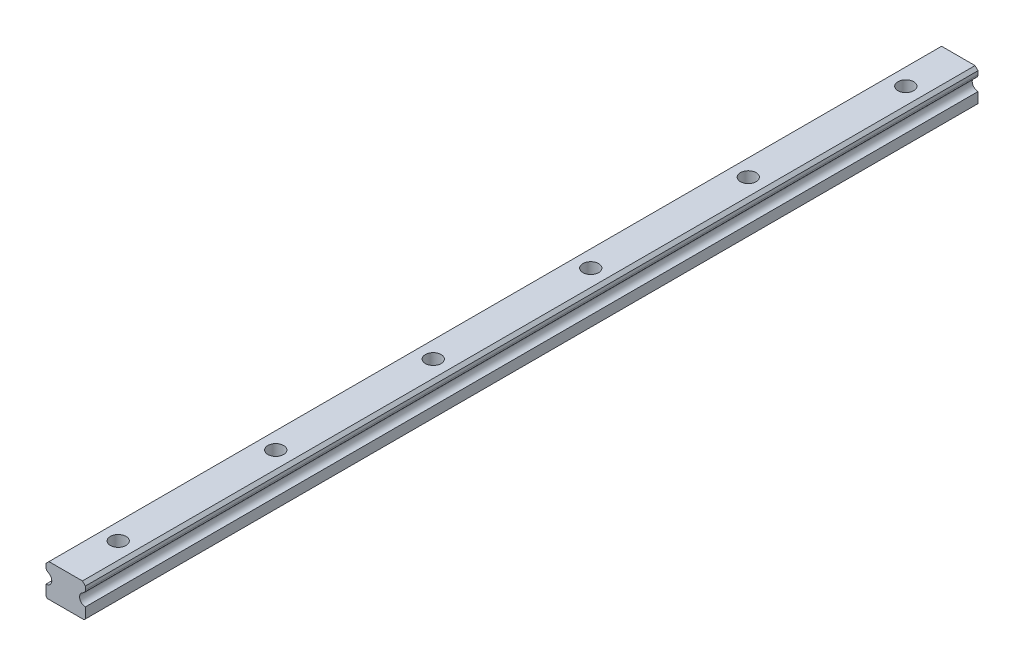
ISO-10303-21;
HEADER;
FILE_DESCRIPTION(('STEP AP214'),'2;1');
FILE_NAME('part.step','',(''),(''),'','','');
FILE_SCHEMA(('AUTOMOTIVE_DESIGN { 1 0 10303 214 1 1 1 1 }'));
ENDSEC;
DATA;
#1=APPLICATION_CONTEXT('core data for automotive mechanical design processes');
#2=APPLICATION_PROTOCOL_DEFINITION('international standard','automotive_design',2000,#1);
#3=PRODUCT_CONTEXT('',#1,'mechanical');
#4=PRODUCT('Part','Part','',(#3));
#5=PRODUCT_RELATED_PRODUCT_CATEGORY('part','',(#4));
#6=PRODUCT_DEFINITION_FORMATION('','',#4);
#7=PRODUCT_DEFINITION_CONTEXT('part definition',#1,'design');
#8=PRODUCT_DEFINITION('design','',#6,#7);
#9=PRODUCT_DEFINITION_SHAPE('','',#8);
#10=(LENGTH_UNIT() NAMED_UNIT(*) SI_UNIT(.MILLI.,.METRE.));
#11=(NAMED_UNIT(*) PLANE_ANGLE_UNIT() SI_UNIT($,.RADIAN.));
#12=(NAMED_UNIT(*) SI_UNIT($,.STERADIAN.) SOLID_ANGLE_UNIT());
#13=UNCERTAINTY_MEASURE_WITH_UNIT(LENGTH_MEASURE(1.E-05),#10,'distance_accuracy_value','');
#14=(GEOMETRIC_REPRESENTATION_CONTEXT(3) GLOBAL_UNCERTAINTY_ASSIGNED_CONTEXT((#13)) GLOBAL_UNIT_ASSIGNED_CONTEXT((#10,
#11,#12)) REPRESENTATION_CONTEXT('',''));
#15=CARTESIAN_POINT('',(0.,0.,0.));
#16=DIRECTION('',(0.,0.,1.));
#17=DIRECTION('',(1.,0.,0.));
#18=AXIS2_PLACEMENT_3D('',#15,#16,#17);
#19=CARTESIAN_POINT('',(-7.5,4.505,170.));
#20=DIRECTION('',(1.,0.,0.));
#21=DIRECTION('',(0.,0.,-1.));
#22=AXIS2_PLACEMENT_3D('',#19,#20,#21);
#23=PLANE('',#22);
#24=DIRECTION('',(0.,0.,-1.));
#25=VECTOR('',#24,1.);
#26=CARTESIAN_POINT('',(-7.5,4.505,170.));
#27=LINE('',#26,#25);
#28=CARTESIAN_POINT('',(-7.5,4.505,170.));
#29=VERTEX_POINT('',#28);
#30=CARTESIAN_POINT('',(-7.5,4.505,-170.));
#31=VERTEX_POINT('',#30);
#32=EDGE_CURVE('E135',#29,#31,#27,.T.);
#33=ORIENTED_EDGE('',*,*,#32,.T.);
#34=DIRECTION('',(0.,-1.,0.));
#35=VECTOR('',#34,1.);
#36=CARTESIAN_POINT('',(-7.5,4.505,-170.));
#37=LINE('',#36,#35);
#38=CARTESIAN_POINT('',(-7.5,0.5,-170.));
#39=VERTEX_POINT('',#38);
#40=EDGE_CURVE('E129',#31,#39,#37,.T.);
#41=ORIENTED_EDGE('',*,*,#40,.T.);
#42=DIRECTION('',(0.,0.,-1.));
#43=VECTOR('',#42,1.);
#44=CARTESIAN_POINT('',(-7.5,0.5,170.));
#45=LINE('',#44,#43);
#46=CARTESIAN_POINT('',(-7.5,0.5,170.));
#47=VERTEX_POINT('',#46);
#48=EDGE_CURVE('E11',#47,#39,#45,.T.);
#49=ORIENTED_EDGE('',*,*,#48,.F.);
#50=DIRECTION('',(0.,-1.,0.));
#51=VECTOR('',#50,1.);
#52=CARTESIAN_POINT('',(-7.5,4.505,170.));
#53=LINE('',#52,#51);
#54=EDGE_CURVE('E176',#29,#47,#53,.T.);
#55=ORIENTED_EDGE('',*,*,#54,.F.);
#56=EDGE_LOOP('',(#33,#41,#49,#55));
#57=FACE_BOUND('',#56,.T.);
#58=ADVANCED_FACE('F17',(#57),#23,.F.);
#59=CARTESIAN_POINT('',(-7.5,0.5,170.));
#60=DIRECTION('',(0.707106781186548,0.707106781186547,0.));
#61=DIRECTION('',(-0.707106781186547,0.707106781186548,0.));
#62=AXIS2_PLACEMENT_3D('',#59,#60,#61);
#63=PLANE('',#62);
#64=ORIENTED_EDGE('',*,*,#48,.T.);
#65=DIRECTION('',(0.707106781186547,-0.707106781186548,0.));
#66=VECTOR('',#65,1.);
#67=CARTESIAN_POINT('',(-7.5,0.5,-170.));
#68=LINE('',#67,#66);
#69=CARTESIAN_POINT('',(-7.,0.,-170.));
#70=VERTEX_POINT('',#69);
#71=EDGE_CURVE('E119',#39,#70,#68,.T.);
#72=ORIENTED_EDGE('',*,*,#71,.T.);
#73=DIRECTION('',(0.,0.,-1.));
#74=VECTOR('',#73,1.);
#75=CARTESIAN_POINT('',(-7.,0.,170.));
#76=LINE('',#75,#74);
#77=CARTESIAN_POINT('',(-7.,0.,170.));
#78=VERTEX_POINT('',#77);
#79=EDGE_CURVE('E24',#78,#70,#76,.T.);
#80=ORIENTED_EDGE('',*,*,#79,.F.);
#81=DIRECTION('',(0.707106781186547,-0.707106781186548,0.));
#82=VECTOR('',#81,1.);
#83=CARTESIAN_POINT('',(-7.5,0.5,170.));
#84=LINE('',#83,#82);
#85=EDGE_CURVE('E120',#47,#78,#84,.T.);
#86=ORIENTED_EDGE('',*,*,#85,.F.);
#87=EDGE_LOOP('',(#64,#72,#80,#86));
#88=FACE_BOUND('',#87,.T.);
#89=ADVANCED_FACE('F117',(#88),#63,.F.);
#90=CARTESIAN_POINT('',(-7.,0.,170.));
#91=DIRECTION('',(0.,1.,0.));
#92=DIRECTION('',(0.,0.,1.));
#93=AXIS2_PLACEMENT_3D('',#90,#91,#92);
#94=PLANE('',#93);
#95=CARTESIAN_POINT('',(0.,0.,150.));
#96=DIRECTION('',(0.,1.,0.));
#97=DIRECTION('',(0.,0.,1.));
#98=AXIS2_PLACEMENT_3D('',#95,#96,#97);
#99=CIRCLE('',#98,1.75);
#100=CARTESIAN_POINT('',(0.,0.,151.75));
#101=VERTEX_POINT('',#100);
#102=EDGE_CURVE('E542',#101,#101,#99,.T.);
#103=ORIENTED_EDGE('',*,*,#102,.T.);
#104=EDGE_LOOP('',(#103));
#105=FACE_BOUND('',#104,.T.);
#106=CARTESIAN_POINT('',(0.,0.,90.));
#107=DIRECTION('',(0.,1.,0.));
#108=DIRECTION('',(0.,0.,1.));
#109=AXIS2_PLACEMENT_3D('',#106,#107,#108);
#110=CIRCLE('',#109,1.75);
#111=CARTESIAN_POINT('',(0.,0.,91.75));
#112=VERTEX_POINT('',#111);
#113=EDGE_CURVE('E552',#112,#112,#110,.T.);
#114=ORIENTED_EDGE('',*,*,#113,.T.);
#115=EDGE_LOOP('',(#114));
#116=FACE_BOUND('',#115,.T.);
#117=CARTESIAN_POINT('',(0.,0.,30.));
#118=DIRECTION('',(0.,1.,0.));
#119=DIRECTION('',(0.,0.,1.));
#120=AXIS2_PLACEMENT_3D('',#117,#118,#119);
#121=CIRCLE('',#120,1.75);
#122=CARTESIAN_POINT('',(0.,0.,31.75));
#123=VERTEX_POINT('',#122);
#124=EDGE_CURVE('E564',#123,#123,#121,.T.);
#125=ORIENTED_EDGE('',*,*,#124,.T.);
#126=EDGE_LOOP('',(#125));
#127=FACE_BOUND('',#126,.T.);
#128=CARTESIAN_POINT('',(0.,0.,-30.));
#129=DIRECTION('',(0.,1.,0.));
#130=DIRECTION('',(0.,0.,1.));
#131=AXIS2_PLACEMENT_3D('',#128,#129,#130);
#132=CIRCLE('',#131,1.75);
#133=CARTESIAN_POINT('',(0.,0.,-28.25));
#134=VERTEX_POINT('',#133);
#135=EDGE_CURVE('E576',#134,#134,#132,.T.);
#136=ORIENTED_EDGE('',*,*,#135,.T.);
#137=EDGE_LOOP('',(#136));
#138=FACE_BOUND('',#137,.T.);
#139=CARTESIAN_POINT('',(0.,0.,-90.));
#140=DIRECTION('',(0.,1.,0.));
#141=DIRECTION('',(0.,0.,1.));
#142=AXIS2_PLACEMENT_3D('',#139,#140,#141);
#143=CIRCLE('',#142,1.75);
#144=CARTESIAN_POINT('',(0.,0.,-88.25));
#145=VERTEX_POINT('',#144);
#146=EDGE_CURVE('E588',#145,#145,#143,.T.);
#147=ORIENTED_EDGE('',*,*,#146,.T.);
#148=EDGE_LOOP('',(#147));
#149=FACE_BOUND('',#148,.T.);
#150=CARTESIAN_POINT('',(0.,0.,-150.));
#151=DIRECTION('',(0.,1.,0.));
#152=DIRECTION('',(0.,0.,1.));
#153=AXIS2_PLACEMENT_3D('',#150,#151,#152);
#154=CIRCLE('',#153,1.75);
#155=CARTESIAN_POINT('',(0.,0.,-148.25));
#156=VERTEX_POINT('',#155);
#157=EDGE_CURVE('E600',#156,#156,#154,.T.);
#158=ORIENTED_EDGE('',*,*,#157,.T.);
#159=EDGE_LOOP('',(#158));
#160=FACE_BOUND('',#159,.T.);
#161=ORIENTED_EDGE('',*,*,#79,.T.);
#162=DIRECTION('',(1.,0.,0.));
#163=VECTOR('',#162,1.);
#164=CARTESIAN_POINT('',(-7.,0.,-170.));
#165=LINE('',#164,#163);
#166=CARTESIAN_POINT('',(7.,0.,-170.));
#167=VERTEX_POINT('',#166);
#168=EDGE_CURVE('E133',#70,#167,#165,.T.);
#169=ORIENTED_EDGE('',*,*,#168,.T.);
#170=DIRECTION('',(0.,0.,-1.));
#171=VECTOR('',#170,1.);
#172=CARTESIAN_POINT('',(7.,0.,170.));
#173=LINE('',#172,#171);
#174=CARTESIAN_POINT('',(7.,0.,170.));
#175=VERTEX_POINT('',#174);
#176=EDGE_CURVE('E222',#175,#167,#173,.T.);
#177=ORIENTED_EDGE('',*,*,#176,.F.);
#178=DIRECTION('',(1.,0.,0.));
#179=VECTOR('',#178,1.);
#180=CARTESIAN_POINT('',(-7.,0.,170.));
#181=LINE('',#180,#179);
#182=EDGE_CURVE('E179',#78,#175,#181,.T.);
#183=ORIENTED_EDGE('',*,*,#182,.F.);
#184=EDGE_LOOP('',(#161,#169,#177,#183));
#185=FACE_BOUND('',#184,.T.);
#186=ADVANCED_FACE('F225',(#105,#116,#127,#138,#149,#160,#185),#94,.F.);
#187=CARTESIAN_POINT('',(7.,0.,170.));
#188=DIRECTION('',(-0.707106781186548,0.707106781186547,0.));
#189=DIRECTION('',(-0.707106781186547,-0.707106781186548,0.));
#190=AXIS2_PLACEMENT_3D('',#187,#188,#189);
#191=PLANE('',#190);
#192=ORIENTED_EDGE('',*,*,#176,.T.);
#193=DIRECTION('',(0.707106781186547,0.707106781186548,0.));
#194=VECTOR('',#193,1.);
#195=CARTESIAN_POINT('',(7.,0.,-170.));
#196=LINE('',#195,#194);
#197=CARTESIAN_POINT('',(7.5,0.5,-170.));
#198=VERTEX_POINT('',#197);
#199=EDGE_CURVE('E144',#167,#198,#196,.T.);
#200=ORIENTED_EDGE('',*,*,#199,.T.);
#201=DIRECTION('',(0.,0.,-1.));
#202=VECTOR('',#201,1.);
#203=CARTESIAN_POINT('',(7.5,0.5,170.));
#204=LINE('',#203,#202);
#205=CARTESIAN_POINT('',(7.5,0.5,170.));
#206=VERTEX_POINT('',#205);
#207=EDGE_CURVE('E220',#206,#198,#204,.T.);
#208=ORIENTED_EDGE('',*,*,#207,.F.);
#209=DIRECTION('',(0.707106781186547,0.707106781186548,0.));
#210=VECTOR('',#209,1.);
#211=CARTESIAN_POINT('',(7.,0.,170.));
#212=LINE('',#211,#210);
#213=EDGE_CURVE('E181',#175,#206,#212,.T.);
#214=ORIENTED_EDGE('',*,*,#213,.F.);
#215=EDGE_LOOP('',(#192,#200,#208,#214));
#216=FACE_BOUND('',#215,.T.);
#217=ADVANCED_FACE('F233',(#216),#191,.F.);
#218=CARTESIAN_POINT('',(7.5,0.5,170.));
#219=DIRECTION('',(-1.,0.,0.));
#220=DIRECTION('',(0.,0.,1.));
#221=AXIS2_PLACEMENT_3D('',#218,#219,#220);
#222=PLANE('',#221);
#223=ORIENTED_EDGE('',*,*,#207,.T.);
#224=DIRECTION('',(0.,1.,0.));
#225=VECTOR('',#224,1.);
#226=CARTESIAN_POINT('',(7.5,0.5,-170.));
#227=LINE('',#226,#225);
#228=CARTESIAN_POINT('',(7.5,4.505,-170.));
#229=VERTEX_POINT('',#228);
#230=EDGE_CURVE('E147',#198,#229,#227,.T.);
#231=ORIENTED_EDGE('',*,*,#230,.T.);
#232=DIRECTION('',(0.,0.,-1.));
#233=VECTOR('',#232,1.);
#234=CARTESIAN_POINT('',(7.5,4.505,170.));
#235=LINE('',#234,#233);
#236=CARTESIAN_POINT('',(7.5,4.505,170.));
#237=VERTEX_POINT('',#236);
#238=EDGE_CURVE('E218',#237,#229,#235,.T.);
#239=ORIENTED_EDGE('',*,*,#238,.F.);
#240=DIRECTION('',(0.,1.,0.));
#241=VECTOR('',#240,1.);
#242=CARTESIAN_POINT('',(7.5,0.5,170.));
#243=LINE('',#242,#241);
#244=EDGE_CURVE('E183',#206,#237,#243,.T.);
#245=ORIENTED_EDGE('',*,*,#244,.F.);
#246=EDGE_LOOP('',(#223,#231,#239,#245));
#247=FACE_BOUND('',#246,.T.);
#248=ADVANCED_FACE('F236',(#247),#222,.F.);
#249=CARTESIAN_POINT('',(7.5,6.705,170.));
#250=DIRECTION('',(0.,0.,-1.));
#251=DIRECTION('',(-1.,0.,0.));
#252=AXIS2_PLACEMENT_3D('',#249,#250,#251);
#253=CYLINDRICAL_SURFACE('',#252,2.2);
#254=ORIENTED_EDGE('',*,*,#238,.T.);
#255=CARTESIAN_POINT('',(7.5,6.705,-170.));
#256=DIRECTION('',(0.,0.,-1.));
#257=DIRECTION('',(-1.,0.,0.));
#258=AXIS2_PLACEMENT_3D('',#255,#256,#257);
#259=CIRCLE('',#258,2.2);
#260=CARTESIAN_POINT('',(6.6081080695801,8.7161013859206,-170.));
#261=VERTEX_POINT('',#260);
#262=EDGE_CURVE('E150',#229,#261,#259,.T.);
#263=ORIENTED_EDGE('',*,*,#262,.T.);
#264=DIRECTION('',(0.,0.,-1.));
#265=VECTOR('',#264,1.);
#266=CARTESIAN_POINT('',(6.6081080695801,8.7161013859206,170.));
#267=LINE('',#266,#265);
#268=CARTESIAN_POINT('',(6.6081080695801,8.7161013859206,170.));
#269=VERTEX_POINT('',#268);
#270=EDGE_CURVE('E216',#269,#261,#267,.T.);
#271=ORIENTED_EDGE('',*,*,#270,.F.);
#272=CARTESIAN_POINT('',(7.5,6.705,170.));
#273=DIRECTION('',(0.,0.,-1.));
#274=DIRECTION('',(-1.,0.,0.));
#275=AXIS2_PLACEMENT_3D('',#272,#273,#274);
#276=CIRCLE('',#275,2.2);
#277=EDGE_CURVE('E185',#237,#269,#276,.T.);
#278=ORIENTED_EDGE('',*,*,#277,.F.);
#279=EDGE_LOOP('',(#254,#263,#271,#278));
#280=FACE_BOUND('',#279,.T.);
#281=ADVANCED_FACE('F241',(#280),#253,.F.);
#282=CARTESIAN_POINT('',(5.99999999999993,10.0873069050576,170.));
#283=DIRECTION('',(0.,0.,-1.));
#284=DIRECTION('',(-1.,0.,0.));
#285=AXIS2_PLACEMENT_3D('',#282,#283,#284);
#286=CYLINDRICAL_SURFACE('',#285,1.50000000000008);
#287=ORIENTED_EDGE('',*,*,#270,.T.);
#288=CARTESIAN_POINT('',(5.99999999999993,10.0873069050576,-170.));
#289=DIRECTION('',(0.,0.,1.));
#290=DIRECTION('',(1.,0.,0.));
#291=AXIS2_PLACEMENT_3D('',#288,#289,#290);
#292=CIRCLE('',#291,1.50000000000008);
#293=CARTESIAN_POINT('',(7.5,10.0873069050576,-170.));
#294=VERTEX_POINT('',#293);
#295=EDGE_CURVE('E153',#261,#294,#292,.T.);
#296=ORIENTED_EDGE('',*,*,#295,.T.);
#297=DIRECTION('',(0.,0.,-1.));
#298=VECTOR('',#297,1.);
#299=CARTESIAN_POINT('',(7.5,10.0873069050576,170.));
#300=LINE('',#299,#298);
#301=CARTESIAN_POINT('',(7.5,10.0873069050576,170.));
#302=VERTEX_POINT('',#301);
#303=EDGE_CURVE('E214',#302,#294,#300,.T.);
#304=ORIENTED_EDGE('',*,*,#303,.F.);
#305=CARTESIAN_POINT('',(5.99999999999993,10.0873069050576,170.));
#306=DIRECTION('',(0.,0.,1.));
#307=DIRECTION('',(1.,0.,0.));
#308=AXIS2_PLACEMENT_3D('',#305,#306,#307);
#309=CIRCLE('',#308,1.50000000000008);
#310=EDGE_CURVE('E187',#269,#302,#309,.T.);
#311=ORIENTED_EDGE('',*,*,#310,.F.);
#312=EDGE_LOOP('',(#287,#296,#304,#311));
#313=FACE_BOUND('',#312,.T.);
#314=ADVANCED_FACE('F247',(#313),#286,.T.);
#315=CARTESIAN_POINT('',(7.5,10.087306905058,170.));
#316=DIRECTION('',(-1.,0.,0.));
#317=DIRECTION('',(0.,0.,1.));
#318=AXIS2_PLACEMENT_3D('',#315,#316,#317);
#319=PLANE('',#318);
#320=ORIENTED_EDGE('',*,*,#303,.T.);
#321=DIRECTION('',(0.,1.,0.));
#322=VECTOR('',#321,1.);
#323=CARTESIAN_POINT('',(7.5,10.087306905058,-170.));
#324=LINE('',#323,#322);
#325=CARTESIAN_POINT('',(7.5,11.375700217913,-170.));
#326=VERTEX_POINT('',#325);
#327=EDGE_CURVE('E156',#294,#326,#324,.T.);
#328=ORIENTED_EDGE('',*,*,#327,.T.);
#329=DIRECTION('',(0.,0.,-1.));
#330=VECTOR('',#329,1.);
#331=CARTESIAN_POINT('',(7.5,11.375700217913,170.));
#332=LINE('',#331,#330);
#333=CARTESIAN_POINT('',(7.5,11.375700217913,170.));
#334=VERTEX_POINT('',#333);
#335=EDGE_CURVE('E212',#334,#326,#332,.T.);
#336=ORIENTED_EDGE('',*,*,#335,.F.);
#337=DIRECTION('',(0.,1.,0.));
#338=VECTOR('',#337,1.);
#339=CARTESIAN_POINT('',(7.5,10.087306905058,170.));
#340=LINE('',#339,#338);
#341=EDGE_CURVE('E189',#302,#334,#340,.T.);
#342=ORIENTED_EDGE('',*,*,#341,.F.);
#343=EDGE_LOOP('',(#320,#328,#336,#342));
#344=FACE_BOUND('',#343,.T.);
#345=ADVANCED_FACE('F251',(#344),#319,.F.);
#346=CARTESIAN_POINT('',(7.5,11.375700217913,170.));
#347=DIRECTION('',(-0.707106781186674,-0.707106781186421,0.));
#348=DIRECTION('',(0.707106781186421,-0.707106781186674,0.));
#349=AXIS2_PLACEMENT_3D('',#346,#347,#348);
#350=PLANE('',#349);
#351=ORIENTED_EDGE('',*,*,#335,.T.);
#352=DIRECTION('',(-0.707106781186421,0.707106781186674,0.));
#353=VECTOR('',#352,1.);
#354=CARTESIAN_POINT('',(7.5,11.375700217913,-170.));
#355=LINE('',#354,#353);
#356=CARTESIAN_POINT('',(6.3757002179134,12.5,-170.));
#357=VERTEX_POINT('',#356);
#358=EDGE_CURVE('E159',#326,#357,#355,.T.);
#359=ORIENTED_EDGE('',*,*,#358,.T.);
#360=DIRECTION('',(0.,0.,-1.));
#361=VECTOR('',#360,1.);
#362=CARTESIAN_POINT('',(6.3757002179134,12.5,170.));
#363=LINE('',#362,#361);
#364=CARTESIAN_POINT('',(6.3757002179134,12.5,170.));
#365=VERTEX_POINT('',#364);
#366=EDGE_CURVE('E210',#365,#357,#363,.T.);
#367=ORIENTED_EDGE('',*,*,#366,.F.);
#368=DIRECTION('',(-0.707106781186421,0.707106781186674,0.));
#369=VECTOR('',#368,1.);
#370=CARTESIAN_POINT('',(7.5,11.375700217913,170.));
#371=LINE('',#370,#369);
#372=EDGE_CURVE('E191',#334,#365,#371,.T.);
#373=ORIENTED_EDGE('',*,*,#372,.F.);
#374=EDGE_LOOP('',(#351,#359,#367,#373));
#375=FACE_BOUND('',#374,.T.);
#376=ADVANCED_FACE('F256',(#375),#350,.F.);
#377=CARTESIAN_POINT('',(6.3757002179134,12.5,170.));
#378=DIRECTION('',(0.,-1.,0.));
#379=DIRECTION('',(0.,0.,-1.));
#380=AXIS2_PLACEMENT_3D('',#377,#378,#379);
#381=PLANE('',#380);
#382=CARTESIAN_POINT('',(0.,12.5,150.));
#383=DIRECTION('',(0.,1.,0.));
#384=DIRECTION('',(0.,0.,1.));
#385=AXIS2_PLACEMENT_3D('',#382,#383,#384);
#386=CIRCLE('',#385,3.);
#387=CARTESIAN_POINT('',(0.,12.5,153.));
#388=VERTEX_POINT('',#387);
#389=EDGE_CURVE('E549',#388,#388,#386,.T.);
#390=ORIENTED_EDGE('',*,*,#389,.F.);
#391=EDGE_LOOP('',(#390));
#392=FACE_BOUND('',#391,.T.);
#393=CARTESIAN_POINT('',(0.,12.5,90.));
#394=DIRECTION('',(0.,1.,0.));
#395=DIRECTION('',(0.,0.,1.));
#396=AXIS2_PLACEMENT_3D('',#393,#394,#395);
#397=CIRCLE('',#396,3.);
#398=CARTESIAN_POINT('',(0.,12.5,93.));
#399=VERTEX_POINT('',#398);
#400=EDGE_CURVE('E561',#399,#399,#397,.T.);
#401=ORIENTED_EDGE('',*,*,#400,.F.);
#402=EDGE_LOOP('',(#401));
#403=FACE_BOUND('',#402,.T.);
#404=CARTESIAN_POINT('',(0.,12.5,30.));
#405=DIRECTION('',(0.,1.,0.));
#406=DIRECTION('',(0.,0.,1.));
#407=AXIS2_PLACEMENT_3D('',#404,#405,#406);
#408=CIRCLE('',#407,3.);
#409=CARTESIAN_POINT('',(0.,12.5,33.));
#410=VERTEX_POINT('',#409);
#411=EDGE_CURVE('E573',#410,#410,#408,.T.);
#412=ORIENTED_EDGE('',*,*,#411,.F.);
#413=EDGE_LOOP('',(#412));
#414=FACE_BOUND('',#413,.T.);
#415=CARTESIAN_POINT('',(0.,12.5,-30.));
#416=DIRECTION('',(0.,1.,0.));
#417=DIRECTION('',(0.,0.,1.));
#418=AXIS2_PLACEMENT_3D('',#415,#416,#417);
#419=CIRCLE('',#418,3.);
#420=CARTESIAN_POINT('',(0.,12.5,-27.));
#421=VERTEX_POINT('',#420);
#422=EDGE_CURVE('E585',#421,#421,#419,.T.);
#423=ORIENTED_EDGE('',*,*,#422,.F.);
#424=EDGE_LOOP('',(#423));
#425=FACE_BOUND('',#424,.T.);
#426=CARTESIAN_POINT('',(0.,12.5,-90.));
#427=DIRECTION('',(0.,1.,0.));
#428=DIRECTION('',(0.,0.,1.));
#429=AXIS2_PLACEMENT_3D('',#426,#427,#428);
#430=CIRCLE('',#429,3.);
#431=CARTESIAN_POINT('',(0.,12.5,-87.));
#432=VERTEX_POINT('',#431);
#433=EDGE_CURVE('E597',#432,#432,#430,.T.);
#434=ORIENTED_EDGE('',*,*,#433,.F.);
#435=EDGE_LOOP('',(#434));
#436=FACE_BOUND('',#435,.T.);
#437=CARTESIAN_POINT('',(0.,12.5,-150.));
#438=DIRECTION('',(0.,1.,0.));
#439=DIRECTION('',(0.,0.,1.));
#440=AXIS2_PLACEMENT_3D('',#437,#438,#439);
#441=CIRCLE('',#440,3.);
#442=CARTESIAN_POINT('',(0.,12.5,-147.));
#443=VERTEX_POINT('',#442);
#444=EDGE_CURVE('E136',#443,#443,#441,.T.);
#445=ORIENTED_EDGE('',*,*,#444,.F.);
#446=EDGE_LOOP('',(#445));
#447=FACE_BOUND('',#446,.T.);
#448=ORIENTED_EDGE('',*,*,#366,.T.);
#449=DIRECTION('',(-1.,0.,0.));
#450=VECTOR('',#449,1.);
#451=CARTESIAN_POINT('',(6.3757002179134,12.5,-170.));
#452=LINE('',#451,#450);
#453=CARTESIAN_POINT('',(-6.3757002179134,12.5,-170.));
#454=VERTEX_POINT('',#453);
#455=EDGE_CURVE('E162',#357,#454,#452,.T.);
#456=ORIENTED_EDGE('',*,*,#455,.T.);
#457=DIRECTION('',(0.,0.,-1.));
#458=VECTOR('',#457,1.);
#459=CARTESIAN_POINT('',(-6.3757002179134,12.5,170.));
#460=LINE('',#459,#458);
#461=CARTESIAN_POINT('',(-6.3757002179134,12.5,170.));
#462=VERTEX_POINT('',#461);
#463=EDGE_CURVE('E208',#462,#454,#460,.T.);
#464=ORIENTED_EDGE('',*,*,#463,.F.);
#465=DIRECTION('',(-1.,0.,0.));
#466=VECTOR('',#465,1.);
#467=CARTESIAN_POINT('',(6.3757002179134,12.5,170.));
#468=LINE('',#467,#466);
#469=EDGE_CURVE('E193',#365,#462,#468,.T.);
#470=ORIENTED_EDGE('',*,*,#469,.F.);
#471=EDGE_LOOP('',(#448,#456,#464,#470));
#472=FACE_BOUND('',#471,.T.);
#473=ADVANCED_FACE('F262',(#392,#403,#414,#425,#436,#447,#472),#381,.F.);
#474=CARTESIAN_POINT('',(-6.3757002179134,12.5,170.));
#475=DIRECTION('',(0.707106781186674,-0.707106781186421,0.));
#476=DIRECTION('',(0.707106781186421,0.707106781186674,0.));
#477=AXIS2_PLACEMENT_3D('',#474,#475,#476);
#478=PLANE('',#477);
#479=ORIENTED_EDGE('',*,*,#463,.T.);
#480=DIRECTION('',(-0.707106781186421,-0.707106781186674,0.));
#481=VECTOR('',#480,1.);
#482=CARTESIAN_POINT('',(-6.3757002179134,12.5,-170.));
#483=LINE('',#482,#481);
#484=CARTESIAN_POINT('',(-7.5,11.375700217913,-170.));
#485=VERTEX_POINT('',#484);
#486=EDGE_CURVE('E165',#454,#485,#483,.T.);
#487=ORIENTED_EDGE('',*,*,#486,.T.);
#488=DIRECTION('',(0.,0.,-1.));
#489=VECTOR('',#488,1.);
#490=CARTESIAN_POINT('',(-7.5,11.375700217913,170.));
#491=LINE('',#490,#489);
#492=CARTESIAN_POINT('',(-7.5,11.375700217913,170.));
#493=VERTEX_POINT('',#492);
#494=EDGE_CURVE('E206',#493,#485,#491,.T.);
#495=ORIENTED_EDGE('',*,*,#494,.F.);
#496=DIRECTION('',(-0.707106781186421,-0.707106781186674,0.));
#497=VECTOR('',#496,1.);
#498=CARTESIAN_POINT('',(-6.3757002179134,12.5,170.));
#499=LINE('',#498,#497);
#500=EDGE_CURVE('E195',#462,#493,#499,.T.);
#501=ORIENTED_EDGE('',*,*,#500,.F.);
#502=EDGE_LOOP('',(#479,#487,#495,#501));
#503=FACE_BOUND('',#502,.T.);
#504=ADVANCED_FACE('F266',(#503),#478,.F.);
#505=CARTESIAN_POINT('',(-7.5,11.375700217913,170.));
#506=DIRECTION('',(1.,0.,0.));
#507=DIRECTION('',(0.,0.,-1.));
#508=AXIS2_PLACEMENT_3D('',#505,#506,#507);
#509=PLANE('',#508);
#510=ORIENTED_EDGE('',*,*,#494,.T.);
#511=DIRECTION('',(0.,-1.,0.));
#512=VECTOR('',#511,1.);
#513=CARTESIAN_POINT('',(-7.5,11.375700217913,-170.));
#514=LINE('',#513,#512);
#515=CARTESIAN_POINT('',(-7.5,10.087306905058,-170.));
#516=VERTEX_POINT('',#515);
#517=EDGE_CURVE('E168',#485,#516,#514,.T.);
#518=ORIENTED_EDGE('',*,*,#517,.T.);
#519=DIRECTION('',(0.,0.,-1.));
#520=VECTOR('',#519,1.);
#521=CARTESIAN_POINT('',(-7.5,10.087306905058,170.));
#522=LINE('',#521,#520);
#523=CARTESIAN_POINT('',(-7.5,10.087306905058,170.));
#524=VERTEX_POINT('',#523);
#525=EDGE_CURVE('E204',#524,#516,#522,.T.);
#526=ORIENTED_EDGE('',*,*,#525,.F.);
#527=DIRECTION('',(0.,-1.,0.));
#528=VECTOR('',#527,1.);
#529=CARTESIAN_POINT('',(-7.5,11.375700217913,170.));
#530=LINE('',#529,#528);
#531=EDGE_CURVE('E197',#493,#524,#530,.T.);
#532=ORIENTED_EDGE('',*,*,#531,.F.);
#533=EDGE_LOOP('',(#510,#518,#526,#532));
#534=FACE_BOUND('',#533,.T.);
#535=ADVANCED_FACE('F271',(#534),#509,.F.);
#536=CARTESIAN_POINT('',(-6.,10.0873069050576,170.));
#537=DIRECTION('',(0.,0.,-1.));
#538=DIRECTION('',(-1.,0.,0.));
#539=AXIS2_PLACEMENT_3D('',#536,#537,#538);
#540=CYLINDRICAL_SURFACE('',#539,1.5);
#541=ORIENTED_EDGE('',*,*,#525,.T.);
#542=CARTESIAN_POINT('',(-6.,10.0873069050576,-170.));
#543=DIRECTION('',(0.,0.,1.));
#544=DIRECTION('',(1.,0.,0.));
#545=AXIS2_PLACEMENT_3D('',#542,#543,#544);
#546=CIRCLE('',#545,1.5);
#547=CARTESIAN_POINT('',(-6.6081080888441,8.7161013944639,-170.));
#548=VERTEX_POINT('',#547);
#549=EDGE_CURVE('E171',#516,#548,#546,.T.);
#550=ORIENTED_EDGE('',*,*,#549,.T.);
#551=DIRECTION('',(0.,0.,-1.));
#552=VECTOR('',#551,1.);
#553=CARTESIAN_POINT('',(-6.6081080888441,8.7161013944639,170.));
#554=LINE('',#553,#552);
#555=CARTESIAN_POINT('',(-6.6081080888441,8.7161013944639,170.));
#556=VERTEX_POINT('',#555);
#557=EDGE_CURVE('E202',#556,#548,#554,.T.);
#558=ORIENTED_EDGE('',*,*,#557,.F.);
#559=CARTESIAN_POINT('',(-6.,10.0873069050576,170.));
#560=DIRECTION('',(0.,0.,1.));
#561=DIRECTION('',(1.,0.,0.));
#562=AXIS2_PLACEMENT_3D('',#559,#560,#561);
#563=CIRCLE('',#562,1.5);
#564=EDGE_CURVE('E36',#524,#556,#563,.T.);
#565=ORIENTED_EDGE('',*,*,#564,.F.);
#566=EDGE_LOOP('',(#541,#550,#558,#565));
#567=FACE_BOUND('',#566,.T.);
#568=ADVANCED_FACE('F274',(#567),#540,.T.);
#569=CARTESIAN_POINT('',(-7.5,6.705,170.));
#570=DIRECTION('',(0.,0.,-1.));
#571=DIRECTION('',(-1.,0.,0.));
#572=AXIS2_PLACEMENT_3D('',#569,#570,#571);
#573=CYLINDRICAL_SURFACE('',#572,2.2);
#574=ORIENTED_EDGE('',*,*,#557,.T.);
#575=CARTESIAN_POINT('',(-7.5,6.705,-170.));
#576=DIRECTION('',(0.,0.,-1.));
#577=DIRECTION('',(-1.,0.,0.));
#578=AXIS2_PLACEMENT_3D('',#575,#576,#577);
#579=CIRCLE('',#578,2.2);
#580=EDGE_CURVE('E174',#548,#31,#579,.T.);
#581=ORIENTED_EDGE('',*,*,#580,.T.);
#582=ORIENTED_EDGE('',*,*,#32,.F.);
#583=CARTESIAN_POINT('',(-7.5,6.705,170.));
#584=DIRECTION('',(0.,0.,-1.));
#585=DIRECTION('',(-1.,0.,0.));
#586=AXIS2_PLACEMENT_3D('',#583,#584,#585);
#587=CIRCLE('',#586,2.2);
#588=EDGE_CURVE('E31',#556,#29,#587,.T.);
#589=ORIENTED_EDGE('',*,*,#588,.F.);
#590=EDGE_LOOP('',(#574,#581,#582,#589));
#591=FACE_BOUND('',#590,.T.);
#592=ADVANCED_FACE('F276',(#591),#573,.F.);
#593=CARTESIAN_POINT('',(7.5,6.705,170.));
#594=DIRECTION('',(0.,0.,-1.));
#595=DIRECTION('',(-1.,0.,0.));
#596=AXIS2_PLACEMENT_3D('',#593,#594,#595);
#597=PLANE('',#596);
#598=ORIENTED_EDGE('',*,*,#54,.T.);
#599=ORIENTED_EDGE('',*,*,#85,.T.);
#600=ORIENTED_EDGE('',*,*,#182,.T.);
#601=ORIENTED_EDGE('',*,*,#213,.T.);
#602=ORIENTED_EDGE('',*,*,#244,.T.);
#603=ORIENTED_EDGE('',*,*,#277,.T.);
#604=ORIENTED_EDGE('',*,*,#310,.T.);
#605=ORIENTED_EDGE('',*,*,#341,.T.);
#606=ORIENTED_EDGE('',*,*,#372,.T.);
#607=ORIENTED_EDGE('',*,*,#469,.T.);
#608=ORIENTED_EDGE('',*,*,#500,.T.);
#609=ORIENTED_EDGE('',*,*,#531,.T.);
#610=ORIENTED_EDGE('',*,*,#564,.T.);
#611=ORIENTED_EDGE('',*,*,#588,.T.);
#612=EDGE_LOOP('',(#598,#599,#600,#601,#602,#603,#604,#605,#606,#607,#608,#609,#610,#611));
#613=FACE_BOUND('',#612,.T.);
#614=ADVANCED_FACE('F228',(#613),#597,.F.);
#615=CARTESIAN_POINT('',(7.5,6.705,-170.));
#616=DIRECTION('',(0.,0.,-1.));
#617=DIRECTION('',(-1.,0.,0.));
#618=AXIS2_PLACEMENT_3D('',#615,#616,#617);
#619=PLANE('',#618);
#620=ORIENTED_EDGE('',*,*,#40,.F.);
#621=ORIENTED_EDGE('',*,*,#580,.F.);
#622=ORIENTED_EDGE('',*,*,#549,.F.);
#623=ORIENTED_EDGE('',*,*,#517,.F.);
#624=ORIENTED_EDGE('',*,*,#486,.F.);
#625=ORIENTED_EDGE('',*,*,#455,.F.);
#626=ORIENTED_EDGE('',*,*,#358,.F.);
#627=ORIENTED_EDGE('',*,*,#327,.F.);
#628=ORIENTED_EDGE('',*,*,#295,.F.);
#629=ORIENTED_EDGE('',*,*,#262,.F.);
#630=ORIENTED_EDGE('',*,*,#230,.F.);
#631=ORIENTED_EDGE('',*,*,#199,.F.);
#632=ORIENTED_EDGE('',*,*,#168,.F.);
#633=ORIENTED_EDGE('',*,*,#71,.F.);
#634=EDGE_LOOP('',(#620,#621,#622,#623,#624,#625,#626,#627,#628,#629,#630,#631,#632,#633));
#635=FACE_BOUND('',#634,.T.);
#636=ADVANCED_FACE('F127',(#635),#619,.T.);
#637=CARTESIAN_POINT('',(0.,0.,-150.));
#638=DIRECTION('',(0.,1.,0.));
#639=DIRECTION('',(0.,0.,1.));
#640=AXIS2_PLACEMENT_3D('',#637,#638,#639);
#641=CYLINDRICAL_SURFACE('',#640,3.);
#642=ORIENTED_EDGE('',*,*,#444,.T.);
#643=EDGE_LOOP('',(#642));
#644=FACE_BOUND('',#643,.T.);
#645=CARTESIAN_POINT('',(0.,8.,-150.));
#646=DIRECTION('',(0.,1.,0.));
#647=DIRECTION('',(0.,0.,1.));
#648=AXIS2_PLACEMENT_3D('',#645,#646,#647);
#649=CIRCLE('',#648,3.);
#650=CARTESIAN_POINT('',(0.,8.,-147.));
#651=VERTEX_POINT('',#650);
#652=EDGE_CURVE('E139',#651,#651,#649,.T.);
#653=ORIENTED_EDGE('',*,*,#652,.F.);
#654=EDGE_LOOP('',(#653));
#655=FACE_BOUND('',#654,.T.);
#656=ADVANCED_FACE('F351',(#644,#655),#641,.F.);
#657=CARTESIAN_POINT('',(0.,8.,-153.));
#658=DIRECTION('',(0.,1.,0.));
#659=DIRECTION('',(0.,0.,1.));
#660=AXIS2_PLACEMENT_3D('',#657,#658,#659);
#661=PLANE('',#660);
#662=ORIENTED_EDGE('',*,*,#652,.T.);
#663=EDGE_LOOP('',(#662));
#664=FACE_BOUND('',#663,.T.);
#665=CARTESIAN_POINT('',(0.,8.,-150.));
#666=DIRECTION('',(0.,1.,0.));
#667=DIRECTION('',(0.,0.,1.));
#668=AXIS2_PLACEMENT_3D('',#665,#666,#667);
#669=CIRCLE('',#668,1.75);
#670=CARTESIAN_POINT('',(0.,8.,-148.25));
#671=VERTEX_POINT('',#670);
#672=EDGE_CURVE('E603',#671,#671,#669,.T.);
#673=ORIENTED_EDGE('',*,*,#672,.F.);
#674=EDGE_LOOP('',(#673));
#675=FACE_BOUND('',#674,.T.);
#676=ADVANCED_FACE('F360',(#664,#675),#661,.T.);
#677=CARTESIAN_POINT('',(0.,0.,-150.));
#678=DIRECTION('',(0.,1.,0.));
#679=DIRECTION('',(0.,0.,1.));
#680=AXIS2_PLACEMENT_3D('',#677,#678,#679);
#681=CYLINDRICAL_SURFACE('',#680,1.75);
#682=ORIENTED_EDGE('',*,*,#672,.T.);
#683=EDGE_LOOP('',(#682));
#684=FACE_BOUND('',#683,.T.);
#685=ORIENTED_EDGE('',*,*,#157,.F.);
#686=EDGE_LOOP('',(#685));
#687=FACE_BOUND('',#686,.T.);
#688=ADVANCED_FACE('F370',(#684,#687),#681,.F.);
#689=CARTESIAN_POINT('',(0.,0.,-90.));
#690=DIRECTION('',(0.,1.,0.));
#691=DIRECTION('',(0.,0.,1.));
#692=AXIS2_PLACEMENT_3D('',#689,#690,#691);
#693=CYLINDRICAL_SURFACE('',#692,3.);
#694=ORIENTED_EDGE('',*,*,#433,.T.);
#695=EDGE_LOOP('',(#694));
#696=FACE_BOUND('',#695,.T.);
#697=CARTESIAN_POINT('',(0.,8.,-90.));
#698=DIRECTION('',(0.,1.,0.));
#699=DIRECTION('',(0.,0.,1.));
#700=AXIS2_PLACEMENT_3D('',#697,#698,#699);
#701=CIRCLE('',#700,3.);
#702=CARTESIAN_POINT('',(0.,8.,-87.));
#703=VERTEX_POINT('',#702);
#704=EDGE_CURVE('E594',#703,#703,#701,.T.);
#705=ORIENTED_EDGE('',*,*,#704,.F.);
#706=EDGE_LOOP('',(#705));
#707=FACE_BOUND('',#706,.T.);
#708=ADVANCED_FACE('F380',(#696,#707),#693,.F.);
#709=CARTESIAN_POINT('',(0.,8.,-93.));
#710=DIRECTION('',(0.,1.,0.));
#711=DIRECTION('',(0.,0.,1.));
#712=AXIS2_PLACEMENT_3D('',#709,#710,#711);
#713=PLANE('',#712);
#714=ORIENTED_EDGE('',*,*,#704,.T.);
#715=EDGE_LOOP('',(#714));
#716=FACE_BOUND('',#715,.T.);
#717=CARTESIAN_POINT('',(0.,8.,-90.));
#718=DIRECTION('',(0.,1.,0.));
#719=DIRECTION('',(0.,0.,1.));
#720=AXIS2_PLACEMENT_3D('',#717,#718,#719);
#721=CIRCLE('',#720,1.75);
#722=CARTESIAN_POINT('',(0.,8.,-88.25));
#723=VERTEX_POINT('',#722);
#724=EDGE_CURVE('E591',#723,#723,#721,.T.);
#725=ORIENTED_EDGE('',*,*,#724,.F.);
#726=EDGE_LOOP('',(#725));
#727=FACE_BOUND('',#726,.T.);
#728=ADVANCED_FACE('F390',(#716,#727),#713,.T.);
#729=CARTESIAN_POINT('',(0.,0.,-90.));
#730=DIRECTION('',(0.,1.,0.));
#731=DIRECTION('',(0.,0.,1.));
#732=AXIS2_PLACEMENT_3D('',#729,#730,#731);
#733=CYLINDRICAL_SURFACE('',#732,1.75);
#734=ORIENTED_EDGE('',*,*,#724,.T.);
#735=EDGE_LOOP('',(#734));
#736=FACE_BOUND('',#735,.T.);
#737=ORIENTED_EDGE('',*,*,#146,.F.);
#738=EDGE_LOOP('',(#737));
#739=FACE_BOUND('',#738,.T.);
#740=ADVANCED_FACE('F400',(#736,#739),#733,.F.);
#741=CARTESIAN_POINT('',(0.,0.,-30.));
#742=DIRECTION('',(0.,1.,0.));
#743=DIRECTION('',(0.,0.,1.));
#744=AXIS2_PLACEMENT_3D('',#741,#742,#743);
#745=CYLINDRICAL_SURFACE('',#744,3.);
#746=ORIENTED_EDGE('',*,*,#422,.T.);
#747=EDGE_LOOP('',(#746));
#748=FACE_BOUND('',#747,.T.);
#749=CARTESIAN_POINT('',(0.,8.,-30.));
#750=DIRECTION('',(0.,1.,0.));
#751=DIRECTION('',(0.,0.,1.));
#752=AXIS2_PLACEMENT_3D('',#749,#750,#751);
#753=CIRCLE('',#752,3.);
#754=CARTESIAN_POINT('',(0.,8.,-27.));
#755=VERTEX_POINT('',#754);
#756=EDGE_CURVE('E582',#755,#755,#753,.T.);
#757=ORIENTED_EDGE('',*,*,#756,.F.);
#758=EDGE_LOOP('',(#757));
#759=FACE_BOUND('',#758,.T.);
#760=ADVANCED_FACE('F410',(#748,#759),#745,.F.);
#761=CARTESIAN_POINT('',(0.,8.,-33.));
#762=DIRECTION('',(0.,1.,0.));
#763=DIRECTION('',(0.,0.,1.));
#764=AXIS2_PLACEMENT_3D('',#761,#762,#763);
#765=PLANE('',#764);
#766=ORIENTED_EDGE('',*,*,#756,.T.);
#767=EDGE_LOOP('',(#766));
#768=FACE_BOUND('',#767,.T.);
#769=CARTESIAN_POINT('',(0.,8.,-30.));
#770=DIRECTION('',(0.,1.,0.));
#771=DIRECTION('',(0.,0.,1.));
#772=AXIS2_PLACEMENT_3D('',#769,#770,#771);
#773=CIRCLE('',#772,1.75);
#774=CARTESIAN_POINT('',(0.,8.,-28.25));
#775=VERTEX_POINT('',#774);
#776=EDGE_CURVE('E579',#775,#775,#773,.T.);
#777=ORIENTED_EDGE('',*,*,#776,.F.);
#778=EDGE_LOOP('',(#777));
#779=FACE_BOUND('',#778,.T.);
#780=ADVANCED_FACE('F420',(#768,#779),#765,.T.);
#781=CARTESIAN_POINT('',(0.,0.,-30.));
#782=DIRECTION('',(0.,1.,0.));
#783=DIRECTION('',(0.,0.,1.));
#784=AXIS2_PLACEMENT_3D('',#781,#782,#783);
#785=CYLINDRICAL_SURFACE('',#784,1.75);
#786=ORIENTED_EDGE('',*,*,#776,.T.);
#787=EDGE_LOOP('',(#786));
#788=FACE_BOUND('',#787,.T.);
#789=ORIENTED_EDGE('',*,*,#135,.F.);
#790=EDGE_LOOP('',(#789));
#791=FACE_BOUND('',#790,.T.);
#792=ADVANCED_FACE('F430',(#788,#791),#785,.F.);
#793=CARTESIAN_POINT('',(0.,0.,30.));
#794=DIRECTION('',(0.,1.,0.));
#795=DIRECTION('',(0.,0.,1.));
#796=AXIS2_PLACEMENT_3D('',#793,#794,#795);
#797=CYLINDRICAL_SURFACE('',#796,3.);
#798=ORIENTED_EDGE('',*,*,#411,.T.);
#799=EDGE_LOOP('',(#798));
#800=FACE_BOUND('',#799,.T.);
#801=CARTESIAN_POINT('',(0.,8.,30.));
#802=DIRECTION('',(0.,1.,0.));
#803=DIRECTION('',(0.,0.,1.));
#804=AXIS2_PLACEMENT_3D('',#801,#802,#803);
#805=CIRCLE('',#804,3.);
#806=CARTESIAN_POINT('',(0.,8.,33.));
#807=VERTEX_POINT('',#806);
#808=EDGE_CURVE('E570',#807,#807,#805,.T.);
#809=ORIENTED_EDGE('',*,*,#808,.F.);
#810=EDGE_LOOP('',(#809));
#811=FACE_BOUND('',#810,.T.);
#812=ADVANCED_FACE('F440',(#800,#811),#797,.F.);
#813=CARTESIAN_POINT('',(0.,8.,27.));
#814=DIRECTION('',(0.,1.,0.));
#815=DIRECTION('',(0.,0.,1.));
#816=AXIS2_PLACEMENT_3D('',#813,#814,#815);
#817=PLANE('',#816);
#818=ORIENTED_EDGE('',*,*,#808,.T.);
#819=EDGE_LOOP('',(#818));
#820=FACE_BOUND('',#819,.T.);
#821=CARTESIAN_POINT('',(0.,8.,30.));
#822=DIRECTION('',(0.,1.,0.));
#823=DIRECTION('',(0.,0.,1.));
#824=AXIS2_PLACEMENT_3D('',#821,#822,#823);
#825=CIRCLE('',#824,1.75);
#826=CARTESIAN_POINT('',(0.,8.,31.75));
#827=VERTEX_POINT('',#826);
#828=EDGE_CURVE('E567',#827,#827,#825,.T.);
#829=ORIENTED_EDGE('',*,*,#828,.F.);
#830=EDGE_LOOP('',(#829));
#831=FACE_BOUND('',#830,.T.);
#832=ADVANCED_FACE('F450',(#820,#831),#817,.T.);
#833=CARTESIAN_POINT('',(0.,0.,30.));
#834=DIRECTION('',(0.,1.,0.));
#835=DIRECTION('',(0.,0.,1.));
#836=AXIS2_PLACEMENT_3D('',#833,#834,#835);
#837=CYLINDRICAL_SURFACE('',#836,1.75);
#838=ORIENTED_EDGE('',*,*,#828,.T.);
#839=EDGE_LOOP('',(#838));
#840=FACE_BOUND('',#839,.T.);
#841=ORIENTED_EDGE('',*,*,#124,.F.);
#842=EDGE_LOOP('',(#841));
#843=FACE_BOUND('',#842,.T.);
#844=ADVANCED_FACE('F460',(#840,#843),#837,.F.);
#845=CARTESIAN_POINT('',(0.,0.,90.));
#846=DIRECTION('',(0.,1.,0.));
#847=DIRECTION('',(0.,0.,1.));
#848=AXIS2_PLACEMENT_3D('',#845,#846,#847);
#849=CYLINDRICAL_SURFACE('',#848,3.);
#850=ORIENTED_EDGE('',*,*,#400,.T.);
#851=EDGE_LOOP('',(#850));
#852=FACE_BOUND('',#851,.T.);
#853=CARTESIAN_POINT('',(0.,8.,90.));
#854=DIRECTION('',(0.,1.,0.));
#855=DIRECTION('',(0.,0.,1.));
#856=AXIS2_PLACEMENT_3D('',#853,#854,#855);
#857=CIRCLE('',#856,3.);
#858=CARTESIAN_POINT('',(0.,8.,93.));
#859=VERTEX_POINT('',#858);
#860=EDGE_CURVE('E558',#859,#859,#857,.T.);
#861=ORIENTED_EDGE('',*,*,#860,.F.);
#862=EDGE_LOOP('',(#861));
#863=FACE_BOUND('',#862,.T.);
#864=ADVANCED_FACE('F470',(#852,#863),#849,.F.);
#865=CARTESIAN_POINT('',(0.,8.,87.));
#866=DIRECTION('',(0.,1.,0.));
#867=DIRECTION('',(0.,0.,1.));
#868=AXIS2_PLACEMENT_3D('',#865,#866,#867);
#869=PLANE('',#868);
#870=ORIENTED_EDGE('',*,*,#860,.T.);
#871=EDGE_LOOP('',(#870));
#872=FACE_BOUND('',#871,.T.);
#873=CARTESIAN_POINT('',(0.,8.,90.));
#874=DIRECTION('',(0.,1.,0.));
#875=DIRECTION('',(0.,0.,1.));
#876=AXIS2_PLACEMENT_3D('',#873,#874,#875);
#877=CIRCLE('',#876,1.75);
#878=CARTESIAN_POINT('',(0.,8.,91.75));
#879=VERTEX_POINT('',#878);
#880=EDGE_CURVE('E555',#879,#879,#877,.T.);
#881=ORIENTED_EDGE('',*,*,#880,.F.);
#882=EDGE_LOOP('',(#881));
#883=FACE_BOUND('',#882,.T.);
#884=ADVANCED_FACE('F480',(#872,#883),#869,.T.);
#885=CARTESIAN_POINT('',(0.,0.,90.));
#886=DIRECTION('',(0.,1.,0.));
#887=DIRECTION('',(0.,0.,1.));
#888=AXIS2_PLACEMENT_3D('',#885,#886,#887);
#889=CYLINDRICAL_SURFACE('',#888,1.75);
#890=ORIENTED_EDGE('',*,*,#880,.T.);
#891=EDGE_LOOP('',(#890));
#892=FACE_BOUND('',#891,.T.);
#893=ORIENTED_EDGE('',*,*,#113,.F.);
#894=EDGE_LOOP('',(#893));
#895=FACE_BOUND('',#894,.T.);
#896=ADVANCED_FACE('F490',(#892,#895),#889,.F.);
#897=CARTESIAN_POINT('',(0.,0.,150.));
#898=DIRECTION('',(0.,1.,0.));
#899=DIRECTION('',(0.,0.,1.));
#900=AXIS2_PLACEMENT_3D('',#897,#898,#899);
#901=CYLINDRICAL_SURFACE('',#900,3.);
#902=ORIENTED_EDGE('',*,*,#389,.T.);
#903=EDGE_LOOP('',(#902));
#904=FACE_BOUND('',#903,.T.);
#905=CARTESIAN_POINT('',(0.,8.,150.));
#906=DIRECTION('',(0.,1.,0.));
#907=DIRECTION('',(0.,0.,1.));
#908=AXIS2_PLACEMENT_3D('',#905,#906,#907);
#909=CIRCLE('',#908,3.);
#910=CARTESIAN_POINT('',(0.,8.,153.));
#911=VERTEX_POINT('',#910);
#912=EDGE_CURVE('E544',#911,#911,#909,.T.);
#913=ORIENTED_EDGE('',*,*,#912,.F.);
#914=EDGE_LOOP('',(#913));
#915=FACE_BOUND('',#914,.T.);
#916=ADVANCED_FACE('F500',(#904,#915),#901,.F.);
#917=CARTESIAN_POINT('',(0.,8.,147.));
#918=DIRECTION('',(0.,1.,0.));
#919=DIRECTION('',(0.,0.,1.));
#920=AXIS2_PLACEMENT_3D('',#917,#918,#919);
#921=PLANE('',#920);
#922=ORIENTED_EDGE('',*,*,#912,.T.);
#923=EDGE_LOOP('',(#922));
#924=FACE_BOUND('',#923,.T.);
#925=CARTESIAN_POINT('',(0.,8.,150.));
#926=DIRECTION('',(0.,1.,0.));
#927=DIRECTION('',(0.,0.,1.));
#928=AXIS2_PLACEMENT_3D('',#925,#926,#927);
#929=CIRCLE('',#928,1.75);
#930=CARTESIAN_POINT('',(0.,8.,151.75));
#931=VERTEX_POINT('',#930);
#932=EDGE_CURVE('E539',#931,#931,#929,.T.);
#933=ORIENTED_EDGE('',*,*,#932,.F.);
#934=EDGE_LOOP('',(#933));
#935=FACE_BOUND('',#934,.T.);
#936=ADVANCED_FACE('F510',(#924,#935),#921,.T.);
#937=CARTESIAN_POINT('',(0.,0.,150.));
#938=DIRECTION('',(0.,1.,0.));
#939=DIRECTION('',(0.,0.,1.));
#940=AXIS2_PLACEMENT_3D('',#937,#938,#939);
#941=CYLINDRICAL_SURFACE('',#940,1.75);
#942=ORIENTED_EDGE('',*,*,#932,.T.);
#943=EDGE_LOOP('',(#942));
#944=FACE_BOUND('',#943,.T.);
#945=ORIENTED_EDGE('',*,*,#102,.F.);
#946=EDGE_LOOP('',(#945));
#947=FACE_BOUND('',#946,.T.);
#948=ADVANCED_FACE('F520',(#944,#947),#941,.F.);
#949=CLOSED_SHELL('',(#58,#89,#186,#217,#248,#281,#314,#345,#376,#473,#504,#535,#568,#592,#614,
#636,#656,#676,#688,#708,#728,#740,#760,#780,#792,#812,#832,#844,#864,#884,#896,#916,#936,#948));
#950=MANIFOLD_SOLID_BREP('B1',#949);
#951=ADVANCED_BREP_SHAPE_REPRESENTATION('',(#18,#950),#14);
#952=SHAPE_DEFINITION_REPRESENTATION(#9,#951);
ENDSEC;
END-ISO-10303-21;
